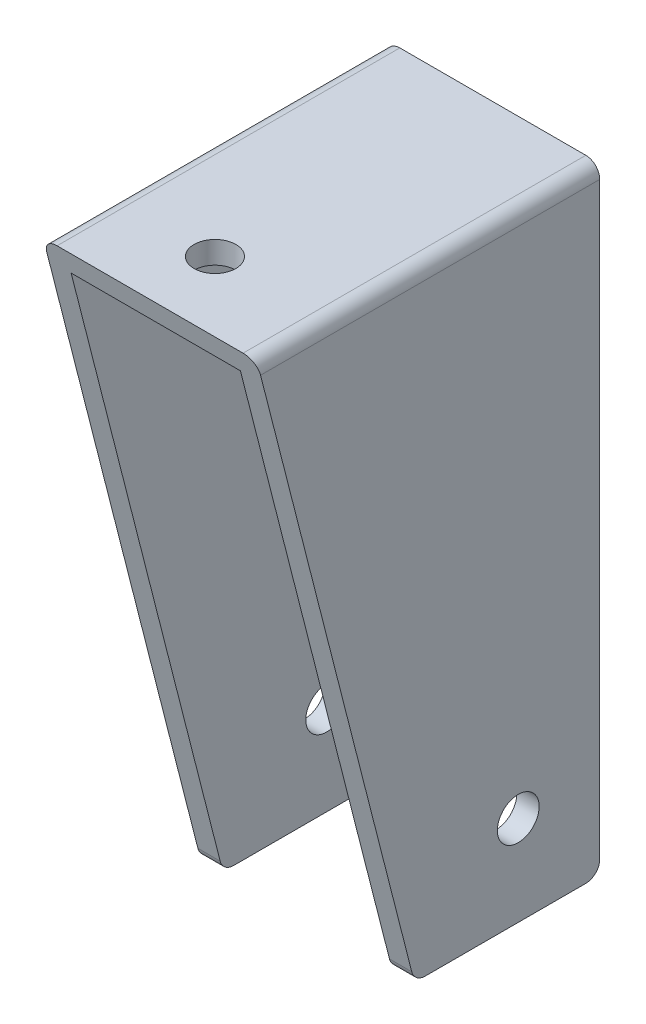
ISO-10303-21;
HEADER;
FILE_DESCRIPTION(('STEP AP214'),'2;1');
FILE_NAME('part.step','',(''),(''),'','','');
FILE_SCHEMA(('AUTOMOTIVE_DESIGN { 1 0 10303 214 1 1 1 1 }'));
ENDSEC;
DATA;
#1=APPLICATION_CONTEXT('core data for automotive mechanical design processes');
#2=APPLICATION_PROTOCOL_DEFINITION('international standard','automotive_design',2000,#1);
#3=PRODUCT_CONTEXT('',#1,'mechanical');
#4=PRODUCT('Part','Part','',(#3));
#5=PRODUCT_RELATED_PRODUCT_CATEGORY('part','',(#4));
#6=PRODUCT_DEFINITION_FORMATION('','',#4);
#7=PRODUCT_DEFINITION_CONTEXT('part definition',#1,'design');
#8=PRODUCT_DEFINITION('design','',#6,#7);
#9=PRODUCT_DEFINITION_SHAPE('','',#8);
#10=(LENGTH_UNIT() NAMED_UNIT(*) SI_UNIT(.MILLI.,.METRE.));
#11=(NAMED_UNIT(*) PLANE_ANGLE_UNIT() SI_UNIT($,.RADIAN.));
#12=(NAMED_UNIT(*) SI_UNIT($,.STERADIAN.) SOLID_ANGLE_UNIT());
#13=UNCERTAINTY_MEASURE_WITH_UNIT(LENGTH_MEASURE(1.E-05),#10,'distance_accuracy_value','');
#14=(GEOMETRIC_REPRESENTATION_CONTEXT(3) GLOBAL_UNCERTAINTY_ASSIGNED_CONTEXT((#13)) GLOBAL_UNIT_ASSIGNED_CONTEXT((#10,
#11,#12)) REPRESENTATION_CONTEXT('',''));
#15=CARTESIAN_POINT('',(0.,0.,0.));
#16=DIRECTION('',(0.,0.,1.));
#17=DIRECTION('',(1.,0.,0.));
#18=AXIS2_PLACEMENT_3D('',#15,#16,#17);
#19=CARTESIAN_POINT('',(15.35,0.,13.3));
#20=DIRECTION('',(0.,1.,0.));
#21=DIRECTION('',(0.,0.,1.));
#22=AXIS2_PLACEMENT_3D('',#19,#20,#21);
#23=PLANE('',#22);
#24=DIRECTION('',(0.,0.,-1.));
#25=VECTOR('',#24,1.);
#26=CARTESIAN_POINT('',(15.35,0.,13.3));
#27=LINE('',#26,#25);
#28=CARTESIAN_POINT('',(15.35,0.,12.5232325226931));
#29=VERTEX_POINT('',#28);
#30=CARTESIAN_POINT('',(15.35,0.,1.));
#31=VERTEX_POINT('',#30);
#32=EDGE_CURVE('E178',#29,#31,#27,.T.);
#33=ORIENTED_EDGE('',*,*,#32,.F.);
#34=DIRECTION('',(-1.,0.,0.));
#35=VECTOR('',#34,1.);
#36=CARTESIAN_POINT('',(15.35,0.,12.5232325226931));
#37=LINE('',#36,#35);
#38=CARTESIAN_POINT('',(13.75,0.,12.5232325226931));
#39=VERTEX_POINT('',#38);
#40=EDGE_CURVE('E251',#29,#39,#37,.T.);
#41=ORIENTED_EDGE('',*,*,#40,.T.);
#42=DIRECTION('',(0.,0.,-1.));
#43=VECTOR('',#42,1.);
#44=CARTESIAN_POINT('',(13.75,0.,24.6));
#45=LINE('',#44,#43);
#46=CARTESIAN_POINT('',(13.75,0.,1.));
#47=VERTEX_POINT('',#46);
#48=EDGE_CURVE('E173',#39,#47,#45,.T.);
#49=ORIENTED_EDGE('',*,*,#48,.T.);
#50=DIRECTION('',(-1.,0.,0.));
#51=VECTOR('',#50,1.);
#52=CARTESIAN_POINT('',(15.35,0.,1.));
#53=LINE('',#52,#51);
#54=EDGE_CURVE('E249',#47,#31,#53,.F.);
#55=ORIENTED_EDGE('',*,*,#54,.T.);
#56=EDGE_LOOP('',(#33,#41,#49,#55));
#57=FACE_BOUND('',#56,.T.);
#58=ADVANCED_FACE('F37',(#57),#23,.F.);
#59=DIRECTION('',(0.,0.,-1.));
#60=VECTOR('',#59,1.);
#61=CARTESIAN_POINT('',(1.6,0.,24.6));
#62=LINE('',#61,#60);
#63=CARTESIAN_POINT('',(1.6,0.,12.5232325226931));
#64=VERTEX_POINT('',#63);
#65=CARTESIAN_POINT('',(1.6,0.,1.));
#66=VERTEX_POINT('',#65);
#67=EDGE_CURVE('E163',#64,#66,#62,.T.);
#68=ORIENTED_EDGE('',*,*,#67,.F.);
#69=DIRECTION('',(-1.,0.,0.));
#70=VECTOR('',#69,1.);
#71=CARTESIAN_POINT('',(15.35,0.,12.5232325226931));
#72=LINE('',#71,#70);
#73=CARTESIAN_POINT('',(0.,0.,12.5232325226931));
#74=VERTEX_POINT('',#73);
#75=EDGE_CURVE('E243',#64,#74,#72,.T.);
#76=ORIENTED_EDGE('',*,*,#75,.T.);
#77=DIRECTION('',(0.,0.,-1.));
#78=VECTOR('',#77,1.);
#79=CARTESIAN_POINT('',(0.,0.,13.3));
#80=LINE('',#79,#78);
#81=CARTESIAN_POINT('',(0.,0.,1.));
#82=VERTEX_POINT('',#81);
#83=EDGE_CURVE('E175',#74,#82,#80,.T.);
#84=ORIENTED_EDGE('',*,*,#83,.T.);
#85=DIRECTION('',(-1.,0.,0.));
#86=VECTOR('',#85,1.);
#87=CARTESIAN_POINT('',(15.35,0.,1.));
#88=LINE('',#87,#86);
#89=EDGE_CURVE('E241',#82,#66,#88,.F.);
#90=ORIENTED_EDGE('',*,*,#89,.T.);
#91=EDGE_LOOP('',(#68,#76,#84,#90));
#92=FACE_BOUND('',#91,.T.);
#93=ADVANCED_FACE('F286',(#92),#23,.F.);
#94=CARTESIAN_POINT('',(15.35,0.,0.));
#95=DIRECTION('',(0.,0.,1.));
#96=DIRECTION('',(1.,0.,0.));
#97=AXIS2_PLACEMENT_3D('',#94,#95,#96);
#98=PLANE('',#97);
#99=DIRECTION('',(-1.,0.,0.));
#100=VECTOR('',#99,1.);
#101=CARTESIAN_POINT('',(15.35,44.26,0.));
#102=LINE('',#101,#100);
#103=CARTESIAN_POINT('',(14.35,44.26,0.));
#104=VERTEX_POINT('',#103);
#105=CARTESIAN_POINT('',(1.,44.26,0.));
#106=VERTEX_POINT('',#105);
#107=EDGE_CURVE('E198',#104,#106,#102,.T.);
#108=ORIENTED_EDGE('',*,*,#107,.F.);
#109=CARTESIAN_POINT('',(14.35,43.26,0.));
#110=DIRECTION('',(0.,0.,1.));
#111=DIRECTION('',(1.,0.,0.));
#112=AXIS2_PLACEMENT_3D('',#109,#110,#111);
#113=CIRCLE('',#112,1.);
#114=CARTESIAN_POINT('',(15.35,43.26,0.));
#115=VERTEX_POINT('',#114);
#116=EDGE_CURVE('E233',#104,#115,#113,.F.);
#117=ORIENTED_EDGE('',*,*,#116,.T.);
#118=DIRECTION('',(0.,1.,0.));
#119=VECTOR('',#118,1.);
#120=CARTESIAN_POINT('',(15.35,0.,0.));
#121=LINE('',#120,#119);
#122=CARTESIAN_POINT('',(15.35,1.,0.));
#123=VERTEX_POINT('',#122);
#124=EDGE_CURVE('E181',#123,#115,#121,.T.);
#125=ORIENTED_EDGE('',*,*,#124,.F.);
#126=DIRECTION('',(-1.,0.,0.));
#127=VECTOR('',#126,1.);
#128=CARTESIAN_POINT('',(15.35,1.,0.));
#129=LINE('',#128,#127);
#130=CARTESIAN_POINT('',(13.75,1.,0.));
#131=VERTEX_POINT('',#130);
#132=EDGE_CURVE('E227',#123,#131,#129,.T.);
#133=ORIENTED_EDGE('',*,*,#132,.T.);
#134=DIRECTION('',(0.,-1.,0.));
#135=VECTOR('',#134,1.);
#136=CARTESIAN_POINT('',(13.75,0.,0.));
#137=LINE('',#136,#135);
#138=CARTESIAN_POINT('',(13.75,42.66,0.));
#139=VERTEX_POINT('',#138);
#140=EDGE_CURVE('E168',#139,#131,#137,.T.);
#141=ORIENTED_EDGE('',*,*,#140,.F.);
#142=DIRECTION('',(1.,0.,0.));
#143=VECTOR('',#142,1.);
#144=CARTESIAN_POINT('',(13.75,42.66,0.));
#145=LINE('',#144,#143);
#146=CARTESIAN_POINT('',(1.6,42.66,0.));
#147=VERTEX_POINT('',#146);
#148=EDGE_CURVE('E152',#147,#139,#145,.T.);
#149=ORIENTED_EDGE('',*,*,#148,.F.);
#150=DIRECTION('',(0.,1.,0.));
#151=VECTOR('',#150,1.);
#152=CARTESIAN_POINT('',(1.6,42.66,0.));
#153=LINE('',#152,#151);
#154=CARTESIAN_POINT('',(1.6,1.,0.));
#155=VERTEX_POINT('',#154);
#156=EDGE_CURVE('E139',#155,#147,#153,.T.);
#157=ORIENTED_EDGE('',*,*,#156,.F.);
#158=DIRECTION('',(-1.,0.,0.));
#159=VECTOR('',#158,1.);
#160=CARTESIAN_POINT('',(15.35,1.,0.));
#161=LINE('',#160,#159);
#162=CARTESIAN_POINT('',(0.,1.,0.));
#163=VERTEX_POINT('',#162);
#164=EDGE_CURVE('E229',#155,#163,#161,.T.);
#165=ORIENTED_EDGE('',*,*,#164,.T.);
#166=DIRECTION('',(0.,1.,0.));
#167=VECTOR('',#166,1.);
#168=CARTESIAN_POINT('',(0.,0.,0.));
#169=LINE('',#168,#167);
#170=CARTESIAN_POINT('',(0.,43.26,0.));
#171=VERTEX_POINT('',#170);
#172=EDGE_CURVE('E191',#163,#171,#169,.T.);
#173=ORIENTED_EDGE('',*,*,#172,.T.);
#174=CARTESIAN_POINT('',(1.,43.26,0.));
#175=DIRECTION('',(0.,0.,1.));
#176=DIRECTION('',(1.,0.,0.));
#177=AXIS2_PLACEMENT_3D('',#174,#175,#176);
#178=CIRCLE('',#177,1.);
#179=EDGE_CURVE('E231',#171,#106,#178,.F.);
#180=ORIENTED_EDGE('',*,*,#179,.T.);
#181=EDGE_LOOP('',(#108,#117,#125,#133,#141,#149,#157,#165,#173,#180));
#182=FACE_BOUND('',#181,.T.);
#183=ADVANCED_FACE('F166',(#182),#98,.F.);
#184=CARTESIAN_POINT('',(15.35,44.26,0.));
#185=DIRECTION('',(0.,-1.,0.));
#186=DIRECTION('',(0.,0.,-1.));
#187=AXIS2_PLACEMENT_3D('',#184,#185,#186);
#188=PLANE('',#187);
#189=CARTESIAN_POINT('',(7.3315188947895,44.26,19.6));
#190=DIRECTION('',(0.,1.,0.));
#191=DIRECTION('',(0.,0.,1.));
#192=AXIS2_PLACEMENT_3D('',#189,#190,#191);
#193=CIRCLE('',#192,1.5);
#194=CARTESIAN_POINT('',(7.3315188947895,44.26,21.1));
#195=VERTEX_POINT('',#194);
#196=EDGE_CURVE('E267',#195,#195,#193,.T.);
#197=ORIENTED_EDGE('',*,*,#196,.F.);
#198=EDGE_LOOP('',(#197));
#199=FACE_BOUND('',#198,.T.);
#200=DIRECTION('',(-1.,0.,0.));
#201=VECTOR('',#200,1.);
#202=CARTESIAN_POINT('',(15.35,44.26,24.6));
#203=LINE('',#202,#201);
#204=CARTESIAN_POINT('',(14.35,44.26,24.6));
#205=VERTEX_POINT('',#204);
#206=CARTESIAN_POINT('',(1.,44.26,24.6));
#207=VERTEX_POINT('',#206);
#208=EDGE_CURVE('E188',#205,#207,#203,.T.);
#209=ORIENTED_EDGE('',*,*,#208,.F.);
#210=DIRECTION('',(0.,0.,1.));
#211=VECTOR('',#210,1.);
#212=CARTESIAN_POINT('',(14.35,44.26,0.));
#213=LINE('',#212,#211);
#214=EDGE_CURVE('E225',#205,#104,#213,.F.);
#215=ORIENTED_EDGE('',*,*,#214,.T.);
#216=ORIENTED_EDGE('',*,*,#107,.T.);
#217=DIRECTION('',(0.,0.,1.));
#218=VECTOR('',#217,1.);
#219=CARTESIAN_POINT('',(1.,44.26,0.));
#220=LINE('',#219,#218);
#221=EDGE_CURVE('E222',#106,#207,#220,.T.);
#222=ORIENTED_EDGE('',*,*,#221,.T.);
#223=EDGE_LOOP('',(#209,#215,#216,#222));
#224=FACE_BOUND('',#223,.T.);
#225=ADVANCED_FACE('F330',(#199,#224),#188,.F.);
#226=CARTESIAN_POINT('',(15.35,44.26,24.6));
#227=DIRECTION('',(0.,0.247374499800691,-0.968919943467136));
#228=DIRECTION('',(0.,0.968919943467136,0.247374499800691));
#229=AXIS2_PLACEMENT_3D('',#226,#227,#228);
#230=PLANE('',#229);
#231=DIRECTION('',(0.,-0.968919943467136,-0.247374499800691));
#232=VECTOR('',#231,1.);
#233=CARTESIAN_POINT('',(15.35,44.26,24.6));
#234=LINE('',#233,#232);
#235=CARTESIAN_POINT('',(15.35,43.26,24.3446904654315));
#236=VERTEX_POINT('',#235);
#237=CARTESIAN_POINT('',(15.35,0.752625500199299,13.4921524661602));
#238=VERTEX_POINT('',#237);
#239=EDGE_CURVE('E185',#236,#238,#234,.T.);
#240=ORIENTED_EDGE('',*,*,#239,.F.);
#241=CARTESIAN_POINT('',(14.35,43.26,24.3446904654315));
#242=DIRECTION('',(0.,0.247374499800691,-0.968919943467136));
#243=DIRECTION('',(0.,-0.968919943467136,-0.247374499800691));
#244=AXIS2_PLACEMENT_3D('',#241,#242,#243);
#245=ELLIPSE('',#244,1.03207701187536,1.);
#246=EDGE_CURVE('E220',#236,#205,#245,.F.);
#247=ORIENTED_EDGE('',*,*,#246,.T.);
#248=ORIENTED_EDGE('',*,*,#208,.T.);
#249=CARTESIAN_POINT('',(1.,43.26,24.3446904654315));
#250=DIRECTION('',(0.,0.247374499800691,-0.968919943467136));
#251=DIRECTION('',(0.,0.968919943467136,0.247374499800691));
#252=AXIS2_PLACEMENT_3D('',#249,#250,#251);
#253=ELLIPSE('',#252,1.03207701187536,1.);
#254=CARTESIAN_POINT('',(0.,43.26,24.3446904654315));
#255=VERTEX_POINT('',#254);
#256=EDGE_CURVE('E218',#207,#255,#253,.F.);
#257=ORIENTED_EDGE('',*,*,#256,.T.);
#258=DIRECTION('',(0.,-0.968919943467136,-0.247374499800691));
#259=VECTOR('',#258,1.);
#260=CARTESIAN_POINT('',(0.,44.26,24.6));
#261=LINE('',#260,#259);
#262=CARTESIAN_POINT('',(0.,0.752625500199299,13.4921524661602));
#263=VERTEX_POINT('',#262);
#264=EDGE_CURVE('E182',#255,#263,#261,.T.);
#265=ORIENTED_EDGE('',*,*,#264,.T.);
#266=DIRECTION('',(-1.,0.,0.));
#267=VECTOR('',#266,1.);
#268=CARTESIAN_POINT('',(15.35,0.752625500199312,13.4921524661602));
#269=LINE('',#268,#267);
#270=CARTESIAN_POINT('',(1.6,0.752625500199312,13.4921524661602));
#271=VERTEX_POINT('',#270);
#272=EDGE_CURVE('E216',#263,#271,#269,.F.);
#273=ORIENTED_EDGE('',*,*,#272,.T.);
#274=DIRECTION('',(0.,0.968919943467136,0.247374499800691));
#275=VECTOR('',#274,1.);
#276=CARTESIAN_POINT('',(1.6,44.26,24.6));
#277=LINE('',#276,#275);
#278=CARTESIAN_POINT('',(1.6,42.66,24.1915047446904));
#279=VERTEX_POINT('',#278);
#280=EDGE_CURVE('E201',#271,#279,#277,.T.);
#281=ORIENTED_EDGE('',*,*,#280,.T.);
#282=DIRECTION('',(1.,0.,0.));
#283=VECTOR('',#282,1.);
#284=CARTESIAN_POINT('',(15.35,42.66,24.1915047446904));
#285=LINE('',#284,#283);
#286=CARTESIAN_POINT('',(13.75,42.66,24.1915047446904));
#287=VERTEX_POINT('',#286);
#288=EDGE_CURVE('E161',#279,#287,#285,.T.);
#289=ORIENTED_EDGE('',*,*,#288,.T.);
#290=DIRECTION('',(0.,-0.968919943467136,-0.247374499800691));
#291=VECTOR('',#290,1.);
#292=CARTESIAN_POINT('',(13.75,44.26,24.6));
#293=LINE('',#292,#291);
#294=CARTESIAN_POINT('',(13.75,0.752625500199312,13.4921524661602));
#295=VERTEX_POINT('',#294);
#296=EDGE_CURVE('E204',#287,#295,#293,.T.);
#297=ORIENTED_EDGE('',*,*,#296,.T.);
#298=DIRECTION('',(-1.,0.,0.));
#299=VECTOR('',#298,1.);
#300=CARTESIAN_POINT('',(15.35,0.752625500199312,13.4921524661602));
#301=LINE('',#300,#299);
#302=EDGE_CURVE('E214',#295,#238,#301,.F.);
#303=ORIENTED_EDGE('',*,*,#302,.T.);
#304=EDGE_LOOP('',(#240,#247,#248,#257,#265,#273,#281,#289,#297,#303));
#305=FACE_BOUND('',#304,.T.);
#306=ADVANCED_FACE('F342',(#305),#230,.F.);
#307=CARTESIAN_POINT('',(15.35,0.,0.));
#308=DIRECTION('',(1.,0.,0.));
#309=DIRECTION('',(0.,0.,-1.));
#310=AXIS2_PLACEMENT_3D('',#307,#308,#309);
#311=PLANE('',#310);
#312=CARTESIAN_POINT('',(15.35,6.46,5.85));
#313=DIRECTION('',(-1.,0.,0.));
#314=DIRECTION('',(0.,0.,1.));
#315=AXIS2_PLACEMENT_3D('',#312,#313,#314);
#316=CIRCLE('',#315,1.5);
#317=CARTESIAN_POINT('',(15.35,6.46,7.35));
#318=VERTEX_POINT('',#317);
#319=EDGE_CURVE('E255',#318,#318,#316,.T.);
#320=ORIENTED_EDGE('',*,*,#319,.T.);
#321=EDGE_LOOP('',(#320));
#322=FACE_BOUND('',#321,.T.);
#323=ORIENTED_EDGE('',*,*,#124,.T.);
#324=DIRECTION('',(0.,0.,1.));
#325=VECTOR('',#324,1.);
#326=CARTESIAN_POINT('',(15.35,43.26,24.6));
#327=LINE('',#326,#325);
#328=EDGE_CURVE('E211',#115,#236,#327,.T.);
#329=ORIENTED_EDGE('',*,*,#328,.T.);
#330=ORIENTED_EDGE('',*,*,#239,.T.);
#331=CARTESIAN_POINT('',(15.35,1.,12.5232325226931));
#332=DIRECTION('',(1.,0.,0.));
#333=DIRECTION('',(0.,0.,-1.));
#334=AXIS2_PLACEMENT_3D('',#331,#332,#333);
#335=CIRCLE('',#334,1.);
#336=EDGE_CURVE('E209',#238,#29,#335,.T.);
#337=ORIENTED_EDGE('',*,*,#336,.T.);
#338=ORIENTED_EDGE('',*,*,#32,.T.);
#339=CARTESIAN_POINT('',(15.35,1.,1.));
#340=DIRECTION('',(1.,0.,0.));
#341=DIRECTION('',(0.,0.,-1.));
#342=AXIS2_PLACEMENT_3D('',#339,#340,#341);
#343=CIRCLE('',#342,1.);
#344=EDGE_CURVE('E207',#31,#123,#343,.T.);
#345=ORIENTED_EDGE('',*,*,#344,.T.);
#346=EDGE_LOOP('',(#323,#329,#330,#337,#338,#345));
#347=FACE_BOUND('',#346,.T.);
#348=ADVANCED_FACE('F336',(#322,#347),#311,.T.);
#349=CARTESIAN_POINT('',(0.,0.,0.));
#350=DIRECTION('',(1.,0.,0.));
#351=DIRECTION('',(0.,0.,-1.));
#352=AXIS2_PLACEMENT_3D('',#349,#350,#351);
#353=PLANE('',#352);
#354=CARTESIAN_POINT('',(0.,6.46,5.85));
#355=DIRECTION('',(-1.,0.,0.));
#356=DIRECTION('',(0.,0.,1.));
#357=AXIS2_PLACEMENT_3D('',#354,#355,#356);
#358=CIRCLE('',#357,1.5);
#359=CARTESIAN_POINT('',(0.,6.46,7.35));
#360=VERTEX_POINT('',#359);
#361=EDGE_CURVE('E260',#360,#360,#358,.T.);
#362=ORIENTED_EDGE('',*,*,#361,.F.);
#363=EDGE_LOOP('',(#362));
#364=FACE_BOUND('',#363,.T.);
#365=ORIENTED_EDGE('',*,*,#264,.F.);
#366=DIRECTION('',(0.,0.,1.));
#367=VECTOR('',#366,1.);
#368=CARTESIAN_POINT('',(0.,43.26,0.));
#369=LINE('',#368,#367);
#370=EDGE_CURVE('E239',#255,#171,#369,.F.);
#371=ORIENTED_EDGE('',*,*,#370,.T.);
#372=ORIENTED_EDGE('',*,*,#172,.F.);
#373=CARTESIAN_POINT('',(0.,1.,1.));
#374=DIRECTION('',(1.,0.,0.));
#375=DIRECTION('',(0.,0.,-1.));
#376=AXIS2_PLACEMENT_3D('',#373,#374,#375);
#377=CIRCLE('',#376,1.);
#378=EDGE_CURVE('E235',#163,#82,#377,.F.);
#379=ORIENTED_EDGE('',*,*,#378,.T.);
#380=ORIENTED_EDGE('',*,*,#83,.F.);
#381=CARTESIAN_POINT('',(0.,1.,12.5232325226931));
#382=DIRECTION('',(1.,0.,0.));
#383=DIRECTION('',(0.,0.,-1.));
#384=AXIS2_PLACEMENT_3D('',#381,#382,#383);
#385=CIRCLE('',#384,1.);
#386=EDGE_CURVE('E237',#74,#263,#385,.F.);
#387=ORIENTED_EDGE('',*,*,#386,.T.);
#388=EDGE_LOOP('',(#365,#371,#372,#379,#380,#387));
#389=FACE_BOUND('',#388,.T.);
#390=ADVANCED_FACE('F323',(#364,#389),#353,.F.);
#391=CARTESIAN_POINT('',(13.75,0.,24.6));
#392=DIRECTION('',(1.,0.,0.));
#393=DIRECTION('',(0.,0.,-1.));
#394=AXIS2_PLACEMENT_3D('',#391,#392,#393);
#395=PLANE('',#394);
#396=CARTESIAN_POINT('',(13.75,6.46,5.85));
#397=DIRECTION('',(1.,0.,0.));
#398=DIRECTION('',(0.,0.,-1.));
#399=AXIS2_PLACEMENT_3D('',#396,#397,#398);
#400=CIRCLE('',#399,1.5);
#401=CARTESIAN_POINT('',(13.75,6.46,4.35));
#402=VERTEX_POINT('',#401);
#403=EDGE_CURVE('E153',#402,#402,#400,.T.);
#404=ORIENTED_EDGE('',*,*,#403,.T.);
#405=EDGE_LOOP('',(#404));
#406=FACE_BOUND('',#405,.T.);
#407=ORIENTED_EDGE('',*,*,#48,.F.);
#408=CARTESIAN_POINT('',(13.75,1.,12.5232325226931));
#409=DIRECTION('',(1.,0.,0.));
#410=DIRECTION('',(0.,0.,-1.));
#411=AXIS2_PLACEMENT_3D('',#408,#409,#410);
#412=CIRCLE('',#411,1.);
#413=EDGE_CURVE('E11',#39,#295,#412,.F.);
#414=ORIENTED_EDGE('',*,*,#413,.T.);
#415=ORIENTED_EDGE('',*,*,#296,.F.);
#416=DIRECTION('',(0.,0.,-1.));
#417=VECTOR('',#416,1.);
#418=CARTESIAN_POINT('',(13.75,42.66,24.6));
#419=LINE('',#418,#417);
#420=EDGE_CURVE('E162',#287,#139,#419,.T.);
#421=ORIENTED_EDGE('',*,*,#420,.T.);
#422=ORIENTED_EDGE('',*,*,#140,.T.);
#423=CARTESIAN_POINT('',(13.75,1.,1.));
#424=DIRECTION('',(1.,0.,0.));
#425=DIRECTION('',(0.,0.,-1.));
#426=AXIS2_PLACEMENT_3D('',#423,#424,#425);
#427=CIRCLE('',#426,1.);
#428=EDGE_CURVE('E46',#131,#47,#427,.F.);
#429=ORIENTED_EDGE('',*,*,#428,.T.);
#430=EDGE_LOOP('',(#407,#414,#415,#421,#422,#429));
#431=FACE_BOUND('',#430,.T.);
#432=ADVANCED_FACE('F340',(#406,#431),#395,.F.);
#433=CARTESIAN_POINT('',(13.75,42.66,24.6));
#434=DIRECTION('',(0.,1.,0.));
#435=DIRECTION('',(0.,0.,1.));
#436=AXIS2_PLACEMENT_3D('',#433,#434,#435);
#437=PLANE('',#436);
#438=CARTESIAN_POINT('',(7.3315188947895,42.66,19.6));
#439=DIRECTION('',(0.,1.,0.));
#440=DIRECTION('',(0.,0.,1.));
#441=AXIS2_PLACEMENT_3D('',#438,#439,#440);
#442=CIRCLE('',#441,1.5);
#443=CARTESIAN_POINT('',(7.3315188947895,42.66,21.1));
#444=VERTEX_POINT('',#443);
#445=EDGE_CURVE('E41',#444,#444,#442,.T.);
#446=ORIENTED_EDGE('',*,*,#445,.T.);
#447=EDGE_LOOP('',(#446));
#448=FACE_BOUND('',#447,.T.);
#449=DIRECTION('',(0.,0.,-1.));
#450=VECTOR('',#449,1.);
#451=CARTESIAN_POINT('',(1.6,42.66,24.6));
#452=LINE('',#451,#450);
#453=EDGE_CURVE('E143',#279,#147,#452,.T.);
#454=ORIENTED_EDGE('',*,*,#453,.T.);
#455=ORIENTED_EDGE('',*,*,#148,.T.);
#456=ORIENTED_EDGE('',*,*,#420,.F.);
#457=ORIENTED_EDGE('',*,*,#288,.F.);
#458=EDGE_LOOP('',(#454,#455,#456,#457));
#459=FACE_BOUND('',#458,.T.);
#460=ADVANCED_FACE('F157',(#448,#459),#437,.F.);
#461=CARTESIAN_POINT('',(1.6,42.66,24.6));
#462=DIRECTION('',(-1.,0.,0.));
#463=DIRECTION('',(0.,-1.,0.));
#464=AXIS2_PLACEMENT_3D('',#461,#462,#463);
#465=PLANE('',#464);
#466=CARTESIAN_POINT('',(1.6,6.46,5.85));
#467=DIRECTION('',(-1.,0.,0.));
#468=DIRECTION('',(0.,-1.,0.));
#469=AXIS2_PLACEMENT_3D('',#466,#467,#468);
#470=CIRCLE('',#469,1.5);
#471=CARTESIAN_POINT('',(1.6,4.96,5.85));
#472=VERTEX_POINT('',#471);
#473=EDGE_CURVE('E253',#472,#472,#470,.T.);
#474=ORIENTED_EDGE('',*,*,#473,.T.);
#475=EDGE_LOOP('',(#474));
#476=FACE_BOUND('',#475,.T.);
#477=ORIENTED_EDGE('',*,*,#280,.F.);
#478=CARTESIAN_POINT('',(1.6,1.,12.5232325226931));
#479=DIRECTION('',(-1.,0.,0.));
#480=DIRECTION('',(0.,-1.,0.));
#481=AXIS2_PLACEMENT_3D('',#478,#479,#480);
#482=CIRCLE('',#481,1.);
#483=EDGE_CURVE('E247',#271,#64,#482,.F.);
#484=ORIENTED_EDGE('',*,*,#483,.T.);
#485=ORIENTED_EDGE('',*,*,#67,.T.);
#486=CARTESIAN_POINT('',(1.6,1.,1.));
#487=DIRECTION('',(-1.,0.,0.));
#488=DIRECTION('',(0.,-1.,0.));
#489=AXIS2_PLACEMENT_3D('',#486,#487,#488);
#490=CIRCLE('',#489,1.);
#491=EDGE_CURVE('E147',#66,#155,#490,.F.);
#492=ORIENTED_EDGE('',*,*,#491,.T.);
#493=ORIENTED_EDGE('',*,*,#156,.T.);
#494=ORIENTED_EDGE('',*,*,#453,.F.);
#495=EDGE_LOOP('',(#477,#484,#485,#492,#493,#494));
#496=FACE_BOUND('',#495,.T.);
#497=ADVANCED_FACE('F142',(#476,#496),#465,.F.);
#498=CARTESIAN_POINT('',(14.35,43.26,0.));
#499=DIRECTION('',(0.,0.,-1.));
#500=DIRECTION('',(0.,1.,0.));
#501=AXIS2_PLACEMENT_3D('',#498,#499,#500);
#502=CYLINDRICAL_SURFACE('',#501,1.);
#503=ORIENTED_EDGE('',*,*,#116,.F.);
#504=ORIENTED_EDGE('',*,*,#214,.F.);
#505=ORIENTED_EDGE('',*,*,#246,.F.);
#506=ORIENTED_EDGE('',*,*,#328,.F.);
#507=EDGE_LOOP('',(#503,#504,#505,#506));
#508=FACE_BOUND('',#507,.T.);
#509=ADVANCED_FACE('F297',(#508),#502,.T.);
#510=CARTESIAN_POINT('',(1.,43.26,0.));
#511=DIRECTION('',(0.,0.,1.));
#512=DIRECTION('',(0.,-1.,0.));
#513=AXIS2_PLACEMENT_3D('',#510,#511,#512);
#514=CYLINDRICAL_SURFACE('',#513,1.);
#515=ORIENTED_EDGE('',*,*,#179,.F.);
#516=ORIENTED_EDGE('',*,*,#370,.F.);
#517=ORIENTED_EDGE('',*,*,#256,.F.);
#518=ORIENTED_EDGE('',*,*,#221,.F.);
#519=EDGE_LOOP('',(#515,#516,#517,#518));
#520=FACE_BOUND('',#519,.T.);
#521=ADVANCED_FACE('F300',(#520),#514,.T.);
#522=CARTESIAN_POINT('',(15.35,1.,12.5232325226931));
#523=DIRECTION('',(-1.,0.,0.));
#524=DIRECTION('',(0.,0.,1.));
#525=AXIS2_PLACEMENT_3D('',#522,#523,#524);
#526=CYLINDRICAL_SURFACE('',#525,1.);
#527=ORIENTED_EDGE('',*,*,#483,.F.);
#528=ORIENTED_EDGE('',*,*,#272,.F.);
#529=ORIENTED_EDGE('',*,*,#386,.F.);
#530=ORIENTED_EDGE('',*,*,#75,.F.);
#531=EDGE_LOOP('',(#527,#528,#529,#530));
#532=FACE_BOUND('',#531,.T.);
#533=ADVANCED_FACE('F304',(#532),#526,.T.);
#534=CARTESIAN_POINT('',(15.35,1.,12.5232325226931));
#535=DIRECTION('',(-1.,0.,0.));
#536=DIRECTION('',(0.,0.,1.));
#537=AXIS2_PLACEMENT_3D('',#534,#535,#536);
#538=CYLINDRICAL_SURFACE('',#537,1.);
#539=ORIENTED_EDGE('',*,*,#336,.F.);
#540=ORIENTED_EDGE('',*,*,#302,.F.);
#541=ORIENTED_EDGE('',*,*,#413,.F.);
#542=ORIENTED_EDGE('',*,*,#40,.F.);
#543=EDGE_LOOP('',(#539,#540,#541,#542));
#544=FACE_BOUND('',#543,.T.);
#545=ADVANCED_FACE('F308',(#544),#538,.T.);
#546=CARTESIAN_POINT('',(15.35,1.,1.));
#547=DIRECTION('',(-1.,0.,0.));
#548=DIRECTION('',(0.,0.,1.));
#549=AXIS2_PLACEMENT_3D('',#546,#547,#548);
#550=CYLINDRICAL_SURFACE('',#549,1.);
#551=ORIENTED_EDGE('',*,*,#491,.F.);
#552=ORIENTED_EDGE('',*,*,#89,.F.);
#553=ORIENTED_EDGE('',*,*,#378,.F.);
#554=ORIENTED_EDGE('',*,*,#164,.F.);
#555=EDGE_LOOP('',(#551,#552,#553,#554));
#556=FACE_BOUND('',#555,.T.);
#557=ADVANCED_FACE('F311',(#556),#550,.T.);
#558=CARTESIAN_POINT('',(15.35,1.,1.));
#559=DIRECTION('',(-1.,0.,0.));
#560=DIRECTION('',(0.,0.,1.));
#561=AXIS2_PLACEMENT_3D('',#558,#559,#560);
#562=CYLINDRICAL_SURFACE('',#561,1.);
#563=ORIENTED_EDGE('',*,*,#344,.F.);
#564=ORIENTED_EDGE('',*,*,#54,.F.);
#565=ORIENTED_EDGE('',*,*,#428,.F.);
#566=ORIENTED_EDGE('',*,*,#132,.F.);
#567=EDGE_LOOP('',(#563,#564,#565,#566));
#568=FACE_BOUND('',#567,.T.);
#569=ADVANCED_FACE('F39',(#568),#562,.T.);
#570=CARTESIAN_POINT('',(15.35,6.46,5.85));
#571=DIRECTION('',(-1.,0.,0.));
#572=DIRECTION('',(0.,0.,1.));
#573=AXIS2_PLACEMENT_3D('',#570,#571,#572);
#574=CYLINDRICAL_SURFACE('',#573,1.5);
#575=ORIENTED_EDGE('',*,*,#361,.T.);
#576=EDGE_LOOP('',(#575));
#577=FACE_BOUND('',#576,.T.);
#578=ORIENTED_EDGE('',*,*,#473,.F.);
#579=EDGE_LOOP('',(#578));
#580=FACE_BOUND('',#579,.T.);
#581=ADVANCED_FACE('F282',(#577,#580),#574,.F.);
#582=ORIENTED_EDGE('',*,*,#319,.F.);
#583=EDGE_LOOP('',(#582));
#584=FACE_BOUND('',#583,.T.);
#585=ORIENTED_EDGE('',*,*,#403,.F.);
#586=EDGE_LOOP('',(#585));
#587=FACE_BOUND('',#586,.T.);
#588=ADVANCED_FACE('F277',(#584,#587),#574,.F.);
#589=CARTESIAN_POINT('',(7.3315188947895,0.,19.6));
#590=DIRECTION('',(0.,1.,0.));
#591=DIRECTION('',(0.,0.,1.));
#592=AXIS2_PLACEMENT_3D('',#589,#590,#591);
#593=CYLINDRICAL_SURFACE('',#592,1.5);
#594=ORIENTED_EDGE('',*,*,#196,.T.);
#595=EDGE_LOOP('',(#594));
#596=FACE_BOUND('',#595,.T.);
#597=ORIENTED_EDGE('',*,*,#445,.F.);
#598=EDGE_LOOP('',(#597));
#599=FACE_BOUND('',#598,.T.);
#600=ADVANCED_FACE('F275',(#596,#599),#593,.F.);
#601=CLOSED_SHELL('',(#58,#93,#183,#225,#306,#348,#390,#432,#460,#497,#509,#521,#533,#545,#557,
#569,#581,#588,#600));
#602=MANIFOLD_SOLID_BREP('B2',#601);
#603=ADVANCED_BREP_SHAPE_REPRESENTATION('',(#18,#602),#14);
#604=SHAPE_DEFINITION_REPRESENTATION(#9,#603);
ENDSEC;
END-ISO-10303-21;
